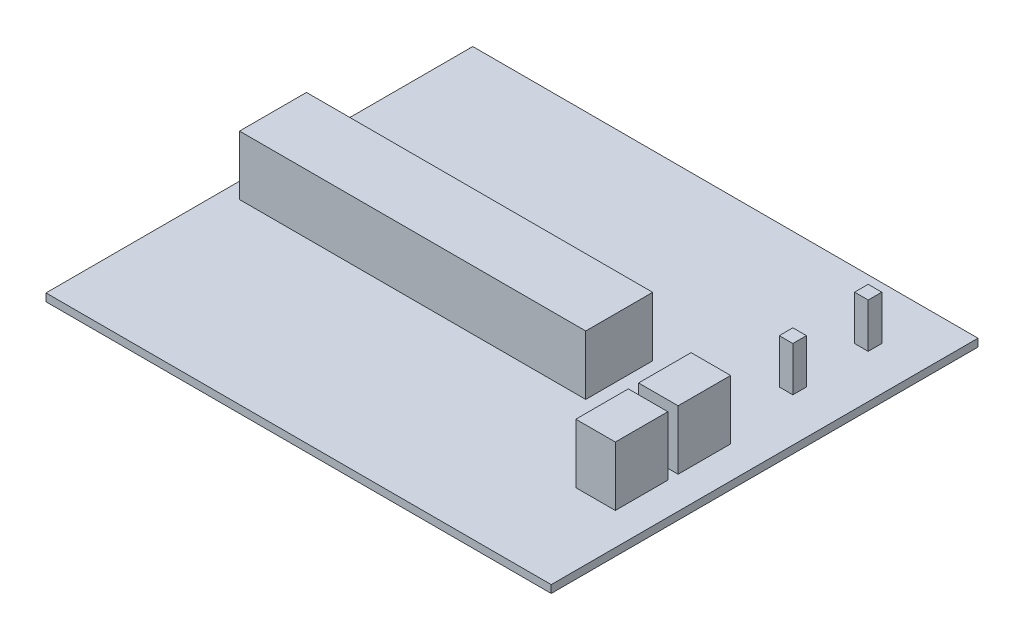
ISO-10303-21;
HEADER;
FILE_DESCRIPTION(('STEP AP214'),'2;1');
FILE_NAME('part.step','',(''),(''),'','','');
FILE_SCHEMA(('AUTOMOTIVE_DESIGN { 1 0 10303 214 1 1 1 1 }'));
ENDSEC;
DATA;
#1=APPLICATION_CONTEXT('core data for automotive mechanical design processes');
#2=APPLICATION_PROTOCOL_DEFINITION('international standard','automotive_design',2000,#1);
#3=PRODUCT_CONTEXT('',#1,'mechanical');
#4=PRODUCT('Part','Part','',(#3));
#5=PRODUCT_RELATED_PRODUCT_CATEGORY('part','',(#4));
#6=PRODUCT_DEFINITION_FORMATION('','',#4);
#7=PRODUCT_DEFINITION_CONTEXT('part definition',#1,'design');
#8=PRODUCT_DEFINITION('design','',#6,#7);
#9=PRODUCT_DEFINITION_SHAPE('','',#8);
#10=(LENGTH_UNIT() NAMED_UNIT(*) SI_UNIT(.MILLI.,.METRE.));
#11=(NAMED_UNIT(*) PLANE_ANGLE_UNIT() SI_UNIT($,.RADIAN.));
#12=(NAMED_UNIT(*) SI_UNIT($,.STERADIAN.) SOLID_ANGLE_UNIT());
#13=UNCERTAINTY_MEASURE_WITH_UNIT(LENGTH_MEASURE(1.E-05),#10,'distance_accuracy_value','');
#14=(GEOMETRIC_REPRESENTATION_CONTEXT(3) GLOBAL_UNCERTAINTY_ASSIGNED_CONTEXT((#13)) GLOBAL_UNIT_ASSIGNED_CONTEXT((#10,
#11,#12)) REPRESENTATION_CONTEXT('',''));
#15=CARTESIAN_POINT('',(0.,0.,0.));
#16=DIRECTION('',(0.,0.,1.));
#17=DIRECTION('',(1.,0.,0.));
#18=AXIS2_PLACEMENT_3D('',#15,#16,#17);
#19=CARTESIAN_POINT('',(0.,1.56,0.));
#20=DIRECTION('',(0.,1.,0.));
#21=DIRECTION('',(0.,0.,1.));
#22=AXIS2_PLACEMENT_3D('',#19,#20,#21);
#23=PLANE('',#22);
#24=DIRECTION('',(-1.,0.,0.));
#25=VECTOR('',#24,1.);
#26=CARTESIAN_POINT('',(93.310019631579,1.56,-60.0792884210526));
#27=LINE('',#26,#25);
#28=CARTESIAN_POINT('',(93.310019631579,1.56,-60.0792884210526));
#29=VERTEX_POINT('',#28);
#30=CARTESIAN_POINT('',(90.558352631579,1.56,-60.0792884210526));
#31=VERTEX_POINT('',#30);
#32=EDGE_CURVE('E224',#29,#31,#27,.T.);
#33=ORIENTED_EDGE('',*,*,#32,.F.);
#34=DIRECTION('',(0.,0.,-1.));
#35=VECTOR('',#34,1.);
#36=CARTESIAN_POINT('',(93.310019631579,1.56,-57.3276214210526));
#37=LINE('',#36,#35);
#38=CARTESIAN_POINT('',(93.310019631579,1.56,-57.3276214210526));
#39=VERTEX_POINT('',#38);
#40=EDGE_CURVE('E221',#39,#29,#37,.T.);
#41=ORIENTED_EDGE('',*,*,#40,.F.);
#42=DIRECTION('',(1.,0.,0.));
#43=VECTOR('',#42,1.);
#44=CARTESIAN_POINT('',(90.558352631579,1.56,-57.3276214210526));
#45=LINE('',#44,#43);
#46=CARTESIAN_POINT('',(90.558352631579,1.56,-57.3276214210526));
#47=VERTEX_POINT('',#46);
#48=EDGE_CURVE('E233',#47,#39,#45,.T.);
#49=ORIENTED_EDGE('',*,*,#48,.F.);
#50=DIRECTION('',(0.,0.,1.));
#51=VECTOR('',#50,1.);
#52=CARTESIAN_POINT('',(90.558352631579,1.56,-60.0792884210526));
#53=LINE('',#52,#51);
#54=EDGE_CURVE('E241',#31,#47,#53,.T.);
#55=ORIENTED_EDGE('',*,*,#54,.F.);
#56=EDGE_LOOP('',(#33,#41,#49,#55));
#57=FACE_BOUND('',#56,.T.);
#58=DIRECTION('',(1.,0.,0.));
#59=VECTOR('',#58,1.);
#60=CARTESIAN_POINT('',(95.615352631579,1.56,-31.8006214210526));
#61=LINE('',#60,#59);
#62=CARTESIAN_POINT('',(87.615352631579,1.56,-31.8006214210526));
#63=VERTEX_POINT('',#62);
#64=CARTESIAN_POINT('',(95.615352631579,1.56,-31.8006214210526));
#65=VERTEX_POINT('',#64);
#66=EDGE_CURVE('E295',#63,#65,#61,.T.);
#67=ORIENTED_EDGE('',*,*,#66,.F.);
#68=DIRECTION('',(0.,0.,1.));
#69=VECTOR('',#68,1.);
#70=CARTESIAN_POINT('',(87.615352631579,1.56,-31.8006214210526));
#71=LINE('',#70,#69);
#72=CARTESIAN_POINT('',(87.615352631579,1.56,-42.4262884210526));
#73=VERTEX_POINT('',#72);
#74=EDGE_CURVE('E281',#73,#63,#71,.T.);
#75=ORIENTED_EDGE('',*,*,#74,.F.);
#76=DIRECTION('',(-1.,0.,0.));
#77=VECTOR('',#76,1.);
#78=CARTESIAN_POINT('',(87.615352631579,1.56,-42.4262884210526));
#79=LINE('',#78,#77);
#80=CARTESIAN_POINT('',(95.615352631579,1.56,-42.4262884210526));
#81=VERTEX_POINT('',#80);
#82=EDGE_CURVE('E286',#81,#73,#79,.T.);
#83=ORIENTED_EDGE('',*,*,#82,.F.);
#84=DIRECTION('',(0.,0.,-1.));
#85=VECTOR('',#84,1.);
#86=CARTESIAN_POINT('',(95.615352631579,1.56,-42.4262884210526));
#87=LINE('',#86,#85);
#88=EDGE_CURVE('E297',#65,#81,#87,.T.);
#89=ORIENTED_EDGE('',*,*,#88,.F.);
#90=EDGE_LOOP('',(#67,#75,#83,#89));
#91=FACE_BOUND('',#90,.T.);
#92=DIRECTION('',(-1.,0.,0.));
#93=VECTOR('',#92,1.);
#94=CARTESIAN_POINT('',(102.115352631579,1.56,-85.9872884210526));
#95=LINE('',#94,#93);
#96=CARTESIAN_POINT('',(102.115352631579,1.56,-85.9872884210526));
#97=VERTEX_POINT('',#96);
#98=CARTESIAN_POINT('',(-0.119647368421035,1.56,-85.9872884210526));
#99=VERTEX_POINT('',#98);
#100=EDGE_CURVE('E340',#97,#99,#95,.T.);
#101=ORIENTED_EDGE('',*,*,#100,.T.);
#102=DIRECTION('',(0.,0.,1.));
#103=VECTOR('',#102,1.);
#104=CARTESIAN_POINT('',(-0.119647368421035,1.56,-85.9872884210526));
#105=LINE('',#104,#103);
#106=CARTESIAN_POINT('',(-0.119647368421035,1.56,0.372711578947374));
#107=VERTEX_POINT('',#106);
#108=EDGE_CURVE('E343',#99,#107,#105,.T.);
#109=ORIENTED_EDGE('',*,*,#108,.T.);
#110=DIRECTION('',(1.,0.,0.));
#111=VECTOR('',#110,1.);
#112=CARTESIAN_POINT('',(-0.119647368421035,1.56,0.372711578947374));
#113=LINE('',#112,#111);
#114=CARTESIAN_POINT('',(102.115352631579,1.56,0.372711578947374));
#115=VERTEX_POINT('',#114);
#116=EDGE_CURVE('E346',#107,#115,#113,.T.);
#117=ORIENTED_EDGE('',*,*,#116,.T.);
#118=DIRECTION('',(0.,0.,-1.));
#119=VECTOR('',#118,1.);
#120=CARTESIAN_POINT('',(102.115352631579,1.56,0.372711578947374));
#121=LINE('',#120,#119);
#122=EDGE_CURVE('E348',#115,#97,#121,.T.);
#123=ORIENTED_EDGE('',*,*,#122,.T.);
#124=EDGE_LOOP('',(#101,#109,#117,#123));
#125=FACE_BOUND('',#124,.T.);
#126=DIRECTION('',(1.,0.,0.));
#127=VECTOR('',#126,1.);
#128=CARTESIAN_POINT('',(3.09768663157897,1.56,-35.5682884210526));
#129=LINE('',#128,#127);
#130=CARTESIAN_POINT('',(3.09768663157897,1.56,-35.5682884210526));
#131=VERTEX_POINT('',#130);
#132=CARTESIAN_POINT('',(73.159352631579,1.56,-35.5682884210526));
#133=VERTEX_POINT('',#132);
#134=EDGE_CURVE('E324',#131,#133,#129,.T.);
#135=ORIENTED_EDGE('',*,*,#134,.F.);
#136=DIRECTION('',(0.,0.,1.));
#137=VECTOR('',#136,1.);
#138=CARTESIAN_POINT('',(3.09768663157897,1.56,-49.1149544210526));
#139=LINE('',#138,#137);
#140=CARTESIAN_POINT('',(3.09768663157897,1.56,-49.1149544210526));
#141=VERTEX_POINT('',#140);
#142=EDGE_CURVE('E310',#141,#131,#139,.T.);
#143=ORIENTED_EDGE('',*,*,#142,.F.);
#144=DIRECTION('',(-1.,0.,0.));
#145=VECTOR('',#144,1.);
#146=CARTESIAN_POINT('',(73.159352631579,1.56,-49.1149544210526));
#147=LINE('',#146,#145);
#148=CARTESIAN_POINT('',(73.159352631579,1.56,-49.1149544210526));
#149=VERTEX_POINT('',#148);
#150=EDGE_CURVE('E315',#149,#141,#147,.T.);
#151=ORIENTED_EDGE('',*,*,#150,.F.);
#152=DIRECTION('',(0.,0.,-1.));
#153=VECTOR('',#152,1.);
#154=CARTESIAN_POINT('',(73.159352631579,1.56,-35.5682884210526));
#155=LINE('',#154,#153);
#156=EDGE_CURVE('E326',#133,#149,#155,.T.);
#157=ORIENTED_EDGE('',*,*,#156,.F.);
#158=EDGE_LOOP('',(#135,#143,#151,#157));
#159=FACE_BOUND('',#158,.T.);
#160=DIRECTION('',(0.,0.,1.));
#161=VECTOR('',#160,1.);
#162=CARTESIAN_POINT('',(87.615352631579,1.56,-29.7262884210526));
#163=LINE('',#162,#161);
#164=CARTESIAN_POINT('',(87.615352631579,1.56,-29.7262884210526));
#165=VERTEX_POINT('',#164);
#166=CARTESIAN_POINT('',(87.615352631579,1.56,-19.1006214210526));
#167=VERTEX_POINT('',#166);
#168=EDGE_CURVE('E266',#165,#167,#163,.T.);
#169=ORIENTED_EDGE('',*,*,#168,.F.);
#170=DIRECTION('',(-1.,0.,0.));
#171=VECTOR('',#170,1.);
#172=CARTESIAN_POINT('',(95.615352631579,1.56,-29.7262884210526));
#173=LINE('',#172,#171);
#174=CARTESIAN_POINT('',(95.615352631579,1.56,-29.7262884210526));
#175=VERTEX_POINT('',#174);
#176=EDGE_CURVE('E252',#175,#165,#173,.T.);
#177=ORIENTED_EDGE('',*,*,#176,.F.);
#178=DIRECTION('',(0.,0.,-1.));
#179=VECTOR('',#178,1.);
#180=CARTESIAN_POINT('',(95.615352631579,1.56,-19.1006214210526));
#181=LINE('',#180,#179);
#182=CARTESIAN_POINT('',(95.615352631579,1.56,-19.1006214210526));
#183=VERTEX_POINT('',#182);
#184=EDGE_CURVE('E257',#183,#175,#181,.T.);
#185=ORIENTED_EDGE('',*,*,#184,.F.);
#186=DIRECTION('',(1.,0.,0.));
#187=VECTOR('',#186,1.);
#188=CARTESIAN_POINT('',(87.615352631579,1.56,-19.1006214210526));
#189=LINE('',#188,#187);
#190=EDGE_CURVE('E268',#167,#183,#189,.T.);
#191=ORIENTED_EDGE('',*,*,#190,.F.);
#192=EDGE_LOOP('',(#169,#177,#185,#191));
#193=FACE_BOUND('',#192,.T.);
#194=DIRECTION('',(1.,0.,0.));
#195=VECTOR('',#194,1.);
#196=CARTESIAN_POINT('',(90.558352631579,1.56,-72.5676214210526));
#197=LINE('',#196,#195);
#198=CARTESIAN_POINT('',(90.558352631579,1.56,-72.5676214210526));
#199=VERTEX_POINT('',#198);
#200=CARTESIAN_POINT('',(93.310019631579,1.56,-72.5676214210526));
#201=VERTEX_POINT('',#200);
#202=EDGE_CURVE('E684',#199,#201,#197,.T.);
#203=ORIENTED_EDGE('',*,*,#202,.F.);
#204=DIRECTION('',(0.,0.,1.));
#205=VECTOR('',#204,1.);
#206=CARTESIAN_POINT('',(90.558352631579,1.56,-75.3192884210526));
#207=LINE('',#206,#205);
#208=CARTESIAN_POINT('',(90.558352631579,1.56,-75.3192884210526));
#209=VERTEX_POINT('',#208);
#210=EDGE_CURVE('E219',#209,#199,#207,.T.);
#211=ORIENTED_EDGE('',*,*,#210,.F.);
#212=DIRECTION('',(-1.,0.,0.));
#213=VECTOR('',#212,1.);
#214=CARTESIAN_POINT('',(93.310019631579,1.56,-75.3192884210526));
#215=LINE('',#214,#213);
#216=CARTESIAN_POINT('',(93.310019631579,1.56,-75.3192884210526));
#217=VERTEX_POINT('',#216);
#218=EDGE_CURVE('E215',#217,#209,#215,.T.);
#219=ORIENTED_EDGE('',*,*,#218,.F.);
#220=DIRECTION('',(0.,0.,-1.));
#221=VECTOR('',#220,1.);
#222=CARTESIAN_POINT('',(93.310019631579,1.56,-72.5676214210526));
#223=LINE('',#222,#221);
#224=EDGE_CURVE('E681',#201,#217,#223,.T.);
#225=ORIENTED_EDGE('',*,*,#224,.F.);
#226=EDGE_LOOP('',(#203,#211,#219,#225));
#227=FACE_BOUND('',#226,.T.);
#228=ADVANCED_FACE('F34',(#57,#91,#125,#159,#193,#227),#23,.T.);
#229=CARTESIAN_POINT('',(102.115352631579,1.56,-85.9872884210526));
#230=DIRECTION('',(0.,0.,1.));
#231=DIRECTION('',(1.,0.,0.));
#232=AXIS2_PLACEMENT_3D('',#229,#230,#231);
#233=PLANE('',#232);
#234=DIRECTION('',(-1.,0.,0.));
#235=VECTOR('',#234,1.);
#236=CARTESIAN_POINT('',(102.115352631579,0.,-85.9872884210526));
#237=LINE('',#236,#235);
#238=CARTESIAN_POINT('',(102.115352631579,0.,-85.9872884210526));
#239=VERTEX_POINT('',#238);
#240=CARTESIAN_POINT('',(-0.119647368421035,0.,-85.9872884210526));
#241=VERTEX_POINT('',#240);
#242=EDGE_CURVE('E339',#239,#241,#237,.T.);
#243=ORIENTED_EDGE('',*,*,#242,.T.);
#244=DIRECTION('',(0.,-1.,0.));
#245=VECTOR('',#244,1.);
#246=CARTESIAN_POINT('',(-0.119647368421035,1.56,-85.9872884210526));
#247=LINE('',#246,#245);
#248=EDGE_CURVE('E11',#99,#241,#247,.T.);
#249=ORIENTED_EDGE('',*,*,#248,.F.);
#250=ORIENTED_EDGE('',*,*,#100,.F.);
#251=DIRECTION('',(0.,-1.,0.));
#252=VECTOR('',#251,1.);
#253=CARTESIAN_POINT('',(102.115352631579,1.56,-85.9872884210526));
#254=LINE('',#253,#252);
#255=EDGE_CURVE('E350',#97,#239,#254,.T.);
#256=ORIENTED_EDGE('',*,*,#255,.T.);
#257=EDGE_LOOP('',(#243,#249,#250,#256));
#258=FACE_BOUND('',#257,.T.);
#259=ADVANCED_FACE('F36',(#258),#233,.F.);
#260=CARTESIAN_POINT('',(-0.119647368421035,1.56,-85.9872884210526));
#261=DIRECTION('',(1.,0.,0.));
#262=DIRECTION('',(0.,0.,-1.));
#263=AXIS2_PLACEMENT_3D('',#260,#261,#262);
#264=PLANE('',#263);
#265=DIRECTION('',(0.,0.,1.));
#266=VECTOR('',#265,1.);
#267=CARTESIAN_POINT('',(-0.119647368421035,0.,-85.9872884210526));
#268=LINE('',#267,#266);
#269=CARTESIAN_POINT('',(-0.119647368421035,0.,0.372711578947374));
#270=VERTEX_POINT('',#269);
#271=EDGE_CURVE('E353',#241,#270,#268,.T.);
#272=ORIENTED_EDGE('',*,*,#271,.T.);
#273=DIRECTION('',(0.,-1.,0.));
#274=VECTOR('',#273,1.);
#275=CARTESIAN_POINT('',(-0.119647368421035,1.56,0.372711578947374));
#276=LINE('',#275,#274);
#277=EDGE_CURVE('E42',#107,#270,#276,.T.);
#278=ORIENTED_EDGE('',*,*,#277,.F.);
#279=ORIENTED_EDGE('',*,*,#108,.F.);
#280=ORIENTED_EDGE('',*,*,#248,.T.);
#281=EDGE_LOOP('',(#272,#278,#279,#280));
#282=FACE_BOUND('',#281,.T.);
#283=ADVANCED_FACE('F383',(#282),#264,.F.);
#284=CARTESIAN_POINT('',(-0.119647368421035,1.56,0.372711578947374));
#285=DIRECTION('',(0.,0.,-1.));
#286=DIRECTION('',(-1.,0.,0.));
#287=AXIS2_PLACEMENT_3D('',#284,#285,#286);
#288=PLANE('',#287);
#289=DIRECTION('',(1.,0.,0.));
#290=VECTOR('',#289,1.);
#291=CARTESIAN_POINT('',(-0.119647368421035,0.,0.372711578947374));
#292=LINE('',#291,#290);
#293=CARTESIAN_POINT('',(102.115352631579,0.,0.372711578947374));
#294=VERTEX_POINT('',#293);
#295=EDGE_CURVE('E355',#270,#294,#292,.T.);
#296=ORIENTED_EDGE('',*,*,#295,.T.);
#297=DIRECTION('',(0.,-1.,0.));
#298=VECTOR('',#297,1.);
#299=CARTESIAN_POINT('',(102.115352631579,1.56,0.372711578947374));
#300=LINE('',#299,#298);
#301=EDGE_CURVE('E360',#115,#294,#300,.T.);
#302=ORIENTED_EDGE('',*,*,#301,.F.);
#303=ORIENTED_EDGE('',*,*,#116,.F.);
#304=ORIENTED_EDGE('',*,*,#277,.T.);
#305=EDGE_LOOP('',(#296,#302,#303,#304));
#306=FACE_BOUND('',#305,.T.);
#307=ADVANCED_FACE('F367',(#306),#288,.F.);
#308=CARTESIAN_POINT('',(102.115352631579,1.56,0.372711578947374));
#309=DIRECTION('',(-1.,0.,0.));
#310=DIRECTION('',(0.,0.,1.));
#311=AXIS2_PLACEMENT_3D('',#308,#309,#310);
#312=PLANE('',#311);
#313=DIRECTION('',(0.,0.,-1.));
#314=VECTOR('',#313,1.);
#315=CARTESIAN_POINT('',(102.115352631579,0.,0.372711578947374));
#316=LINE('',#315,#314);
#317=EDGE_CURVE('E344',#294,#239,#316,.T.);
#318=ORIENTED_EDGE('',*,*,#317,.T.);
#319=ORIENTED_EDGE('',*,*,#255,.F.);
#320=ORIENTED_EDGE('',*,*,#122,.F.);
#321=ORIENTED_EDGE('',*,*,#301,.T.);
#322=EDGE_LOOP('',(#318,#319,#320,#321));
#323=FACE_BOUND('',#322,.T.);
#324=ADVANCED_FACE('F376',(#323),#312,.F.);
#325=CARTESIAN_POINT('',(0.,0.,0.));
#326=DIRECTION('',(0.,1.,0.));
#327=DIRECTION('',(0.,0.,1.));
#328=AXIS2_PLACEMENT_3D('',#325,#326,#327);
#329=PLANE('',#328);
#330=ORIENTED_EDGE('',*,*,#242,.F.);
#331=ORIENTED_EDGE('',*,*,#317,.F.);
#332=ORIENTED_EDGE('',*,*,#295,.F.);
#333=ORIENTED_EDGE('',*,*,#271,.F.);
#334=EDGE_LOOP('',(#330,#331,#332,#333));
#335=FACE_BOUND('',#334,.T.);
#336=ADVANCED_FACE('F373',(#335),#329,.F.);
#337=CARTESIAN_POINT('',(3.09768663157897,13.56,-49.1149544210526));
#338=DIRECTION('',(1.,0.,0.));
#339=DIRECTION('',(0.,0.,-1.));
#340=AXIS2_PLACEMENT_3D('',#337,#338,#339);
#341=PLANE('',#340);
#342=ORIENTED_EDGE('',*,*,#142,.T.);
#343=DIRECTION('',(0.,-1.,0.));
#344=VECTOR('',#343,1.);
#345=CARTESIAN_POINT('',(3.09768663157897,13.56,-35.5682884210526));
#346=LINE('',#345,#344);
#347=CARTESIAN_POINT('',(3.09768663157897,13.56,-35.5682884210526));
#348=VERTEX_POINT('',#347);
#349=EDGE_CURVE('E337',#348,#131,#346,.T.);
#350=ORIENTED_EDGE('',*,*,#349,.F.);
#351=DIRECTION('',(0.,0.,1.));
#352=VECTOR('',#351,1.);
#353=CARTESIAN_POINT('',(3.09768663157897,13.56,-49.1149544210526));
#354=LINE('',#353,#352);
#355=CARTESIAN_POINT('',(3.09768663157897,13.56,-49.1149544210526));
#356=VERTEX_POINT('',#355);
#357=EDGE_CURVE('E311',#356,#348,#354,.T.);
#358=ORIENTED_EDGE('',*,*,#357,.F.);
#359=DIRECTION('',(0.,-1.,0.));
#360=VECTOR('',#359,1.);
#361=CARTESIAN_POINT('',(3.09768663157897,13.56,-49.1149544210526));
#362=LINE('',#361,#360);
#363=EDGE_CURVE('E321',#356,#141,#362,.T.);
#364=ORIENTED_EDGE('',*,*,#363,.T.);
#365=EDGE_LOOP('',(#342,#350,#358,#364));
#366=FACE_BOUND('',#365,.T.);
#367=ADVANCED_FACE('F399',(#366),#341,.F.);
#368=CARTESIAN_POINT('',(3.09768663157897,13.56,-35.5682884210526));
#369=DIRECTION('',(0.,0.,-1.));
#370=DIRECTION('',(-1.,0.,0.));
#371=AXIS2_PLACEMENT_3D('',#368,#369,#370);
#372=PLANE('',#371);
#373=ORIENTED_EDGE('',*,*,#134,.T.);
#374=DIRECTION('',(0.,-1.,0.));
#375=VECTOR('',#374,1.);
#376=CARTESIAN_POINT('',(73.159352631579,13.56,-35.5682884210526));
#377=LINE('',#376,#375);
#378=CARTESIAN_POINT('',(73.159352631579,13.56,-35.5682884210526));
#379=VERTEX_POINT('',#378);
#380=EDGE_CURVE('E334',#379,#133,#377,.T.);
#381=ORIENTED_EDGE('',*,*,#380,.F.);
#382=DIRECTION('',(1.,0.,0.));
#383=VECTOR('',#382,1.);
#384=CARTESIAN_POINT('',(3.09768663157897,13.56,-35.5682884210526));
#385=LINE('',#384,#383);
#386=EDGE_CURVE('E314',#348,#379,#385,.T.);
#387=ORIENTED_EDGE('',*,*,#386,.F.);
#388=ORIENTED_EDGE('',*,*,#349,.T.);
#389=EDGE_LOOP('',(#373,#381,#387,#388));
#390=FACE_BOUND('',#389,.T.);
#391=ADVANCED_FACE('F418',(#390),#372,.F.);
#392=CARTESIAN_POINT('',(73.159352631579,13.56,-35.5682884210526));
#393=DIRECTION('',(-1.,0.,0.));
#394=DIRECTION('',(0.,0.,1.));
#395=AXIS2_PLACEMENT_3D('',#392,#393,#394);
#396=PLANE('',#395);
#397=ORIENTED_EDGE('',*,*,#156,.T.);
#398=DIRECTION('',(0.,-1.,0.));
#399=VECTOR('',#398,1.);
#400=CARTESIAN_POINT('',(73.159352631579,13.56,-49.1149544210526));
#401=LINE('',#400,#399);
#402=CARTESIAN_POINT('',(73.159352631579,13.56,-49.1149544210526));
#403=VERTEX_POINT('',#402);
#404=EDGE_CURVE('E332',#403,#149,#401,.T.);
#405=ORIENTED_EDGE('',*,*,#404,.F.);
#406=DIRECTION('',(0.,0.,-1.));
#407=VECTOR('',#406,1.);
#408=CARTESIAN_POINT('',(73.159352631579,13.56,-35.5682884210526));
#409=LINE('',#408,#407);
#410=EDGE_CURVE('E317',#379,#403,#409,.T.);
#411=ORIENTED_EDGE('',*,*,#410,.F.);
#412=ORIENTED_EDGE('',*,*,#380,.T.);
#413=EDGE_LOOP('',(#397,#405,#411,#412));
#414=FACE_BOUND('',#413,.T.);
#415=ADVANCED_FACE('F425',(#414),#396,.F.);
#416=CARTESIAN_POINT('',(73.159352631579,13.56,-49.1149544210526));
#417=DIRECTION('',(0.,0.,1.));
#418=DIRECTION('',(1.,0.,0.));
#419=AXIS2_PLACEMENT_3D('',#416,#417,#418);
#420=PLANE('',#419);
#421=ORIENTED_EDGE('',*,*,#150,.T.);
#422=ORIENTED_EDGE('',*,*,#363,.F.);
#423=DIRECTION('',(-1.,0.,0.));
#424=VECTOR('',#423,1.);
#425=CARTESIAN_POINT('',(73.159352631579,13.56,-49.1149544210526));
#426=LINE('',#425,#424);
#427=EDGE_CURVE('E319',#403,#356,#426,.T.);
#428=ORIENTED_EDGE('',*,*,#427,.F.);
#429=ORIENTED_EDGE('',*,*,#404,.T.);
#430=EDGE_LOOP('',(#421,#422,#428,#429));
#431=FACE_BOUND('',#430,.T.);
#432=ADVANCED_FACE('F432',(#431),#420,.F.);
#433=CARTESIAN_POINT('',(0.,13.56,0.));
#434=DIRECTION('',(0.,1.,0.));
#435=DIRECTION('',(0.,0.,1.));
#436=AXIS2_PLACEMENT_3D('',#433,#434,#435);
#437=PLANE('',#436);
#438=ORIENTED_EDGE('',*,*,#357,.T.);
#439=ORIENTED_EDGE('',*,*,#386,.T.);
#440=ORIENTED_EDGE('',*,*,#410,.T.);
#441=ORIENTED_EDGE('',*,*,#427,.T.);
#442=EDGE_LOOP('',(#438,#439,#440,#441));
#443=FACE_BOUND('',#442,.T.);
#444=ADVANCED_FACE('F440',(#443),#437,.T.);
#445=CARTESIAN_POINT('',(87.615352631579,13.56,-31.8006214210526));
#446=DIRECTION('',(1.,0.,0.));
#447=DIRECTION('',(0.,0.,-1.));
#448=AXIS2_PLACEMENT_3D('',#445,#446,#447);
#449=PLANE('',#448);
#450=ORIENTED_EDGE('',*,*,#74,.T.);
#451=DIRECTION('',(0.,-1.,0.));
#452=VECTOR('',#451,1.);
#453=CARTESIAN_POINT('',(87.615352631579,13.56,-31.8006214210526));
#454=LINE('',#453,#452);
#455=CARTESIAN_POINT('',(87.615352631579,13.56,-31.8006214210526));
#456=VERTEX_POINT('',#455);
#457=EDGE_CURVE('E308',#456,#63,#454,.T.);
#458=ORIENTED_EDGE('',*,*,#457,.F.);
#459=DIRECTION('',(0.,0.,1.));
#460=VECTOR('',#459,1.);
#461=CARTESIAN_POINT('',(87.615352631579,13.56,-31.8006214210526));
#462=LINE('',#461,#460);
#463=CARTESIAN_POINT('',(87.615352631579,13.56,-42.4262884210526));
#464=VERTEX_POINT('',#463);
#465=EDGE_CURVE('E282',#464,#456,#462,.T.);
#466=ORIENTED_EDGE('',*,*,#465,.F.);
#467=DIRECTION('',(0.,-1.,0.));
#468=VECTOR('',#467,1.);
#469=CARTESIAN_POINT('',(87.615352631579,13.56,-42.4262884210526));
#470=LINE('',#469,#468);
#471=EDGE_CURVE('E292',#464,#73,#470,.T.);
#472=ORIENTED_EDGE('',*,*,#471,.T.);
#473=EDGE_LOOP('',(#450,#458,#466,#472));
#474=FACE_BOUND('',#473,.T.);
#475=ADVANCED_FACE('F449',(#474),#449,.F.);
#476=CARTESIAN_POINT('',(95.615352631579,13.56,-31.8006214210526));
#477=DIRECTION('',(0.,0.,-1.));
#478=DIRECTION('',(-1.,0.,0.));
#479=AXIS2_PLACEMENT_3D('',#476,#477,#478);
#480=PLANE('',#479);
#481=ORIENTED_EDGE('',*,*,#66,.T.);
#482=DIRECTION('',(0.,-1.,0.));
#483=VECTOR('',#482,1.);
#484=CARTESIAN_POINT('',(95.615352631579,13.56,-31.8006214210526));
#485=LINE('',#484,#483);
#486=CARTESIAN_POINT('',(95.615352631579,13.56,-31.8006214210526));
#487=VERTEX_POINT('',#486);
#488=EDGE_CURVE('E305',#487,#65,#485,.T.);
#489=ORIENTED_EDGE('',*,*,#488,.F.);
#490=DIRECTION('',(1.,0.,0.));
#491=VECTOR('',#490,1.);
#492=CARTESIAN_POINT('',(95.615352631579,13.56,-31.8006214210526));
#493=LINE('',#492,#491);
#494=EDGE_CURVE('E285',#456,#487,#493,.T.);
#495=ORIENTED_EDGE('',*,*,#494,.F.);
#496=ORIENTED_EDGE('',*,*,#457,.T.);
#497=EDGE_LOOP('',(#481,#489,#495,#496));
#498=FACE_BOUND('',#497,.T.);
#499=ADVANCED_FACE('F456',(#498),#480,.F.);
#500=CARTESIAN_POINT('',(95.615352631579,13.56,-42.4262884210526));
#501=DIRECTION('',(-1.,0.,0.));
#502=DIRECTION('',(0.,0.,1.));
#503=AXIS2_PLACEMENT_3D('',#500,#501,#502);
#504=PLANE('',#503);
#505=ORIENTED_EDGE('',*,*,#88,.T.);
#506=DIRECTION('',(0.,-1.,0.));
#507=VECTOR('',#506,1.);
#508=CARTESIAN_POINT('',(95.615352631579,13.56,-42.4262884210526));
#509=LINE('',#508,#507);
#510=CARTESIAN_POINT('',(95.615352631579,13.56,-42.4262884210526));
#511=VERTEX_POINT('',#510);
#512=EDGE_CURVE('E303',#511,#81,#509,.T.);
#513=ORIENTED_EDGE('',*,*,#512,.F.);
#514=DIRECTION('',(0.,0.,-1.));
#515=VECTOR('',#514,1.);
#516=CARTESIAN_POINT('',(95.615352631579,13.56,-42.4262884210526));
#517=LINE('',#516,#515);
#518=EDGE_CURVE('E288',#487,#511,#517,.T.);
#519=ORIENTED_EDGE('',*,*,#518,.F.);
#520=ORIENTED_EDGE('',*,*,#488,.T.);
#521=EDGE_LOOP('',(#505,#513,#519,#520));
#522=FACE_BOUND('',#521,.T.);
#523=ADVANCED_FACE('F464',(#522),#504,.F.);
#524=CARTESIAN_POINT('',(87.615352631579,13.56,-42.4262884210526));
#525=DIRECTION('',(0.,0.,1.));
#526=DIRECTION('',(1.,0.,0.));
#527=AXIS2_PLACEMENT_3D('',#524,#525,#526);
#528=PLANE('',#527);
#529=ORIENTED_EDGE('',*,*,#82,.T.);
#530=ORIENTED_EDGE('',*,*,#471,.F.);
#531=DIRECTION('',(-1.,0.,0.));
#532=VECTOR('',#531,1.);
#533=CARTESIAN_POINT('',(87.615352631579,13.56,-42.4262884210526));
#534=LINE('',#533,#532);
#535=EDGE_CURVE('E290',#511,#464,#534,.T.);
#536=ORIENTED_EDGE('',*,*,#535,.F.);
#537=ORIENTED_EDGE('',*,*,#512,.T.);
#538=EDGE_LOOP('',(#529,#530,#536,#537));
#539=FACE_BOUND('',#538,.T.);
#540=ADVANCED_FACE('F472',(#539),#528,.F.);
#541=CARTESIAN_POINT('',(0.,13.56,0.));
#542=DIRECTION('',(0.,-1.,0.));
#543=DIRECTION('',(0.,0.,-1.));
#544=AXIS2_PLACEMENT_3D('',#541,#542,#543);
#545=PLANE('',#544);
#546=ORIENTED_EDGE('',*,*,#465,.T.);
#547=ORIENTED_EDGE('',*,*,#494,.T.);
#548=ORIENTED_EDGE('',*,*,#518,.T.);
#549=ORIENTED_EDGE('',*,*,#535,.T.);
#550=EDGE_LOOP('',(#546,#547,#548,#549));
#551=FACE_BOUND('',#550,.T.);
#552=ADVANCED_FACE('F480',(#551),#545,.F.);
#553=CARTESIAN_POINT('',(95.615352631579,13.56,-29.7262884210526));
#554=DIRECTION('',(0.,0.,1.));
#555=DIRECTION('',(1.,0.,0.));
#556=AXIS2_PLACEMENT_3D('',#553,#554,#555);
#557=PLANE('',#556);
#558=ORIENTED_EDGE('',*,*,#176,.T.);
#559=DIRECTION('',(0.,-1.,0.));
#560=VECTOR('',#559,1.);
#561=CARTESIAN_POINT('',(87.615352631579,13.56,-29.7262884210526));
#562=LINE('',#561,#560);
#563=CARTESIAN_POINT('',(87.615352631579,13.56,-29.7262884210526));
#564=VERTEX_POINT('',#563);
#565=EDGE_CURVE('E279',#564,#165,#562,.T.);
#566=ORIENTED_EDGE('',*,*,#565,.F.);
#567=DIRECTION('',(-1.,0.,0.));
#568=VECTOR('',#567,1.);
#569=CARTESIAN_POINT('',(95.615352631579,13.56,-29.7262884210526));
#570=LINE('',#569,#568);
#571=CARTESIAN_POINT('',(95.615352631579,13.56,-29.7262884210526));
#572=VERTEX_POINT('',#571);
#573=EDGE_CURVE('E253',#572,#564,#570,.T.);
#574=ORIENTED_EDGE('',*,*,#573,.F.);
#575=DIRECTION('',(0.,-1.,0.));
#576=VECTOR('',#575,1.);
#577=CARTESIAN_POINT('',(95.615352631579,13.56,-29.7262884210526));
#578=LINE('',#577,#576);
#579=EDGE_CURVE('E263',#572,#175,#578,.T.);
#580=ORIENTED_EDGE('',*,*,#579,.T.);
#581=EDGE_LOOP('',(#558,#566,#574,#580));
#582=FACE_BOUND('',#581,.T.);
#583=ADVANCED_FACE('F488',(#582),#557,.F.);
#584=CARTESIAN_POINT('',(87.615352631579,13.56,-29.7262884210526));
#585=DIRECTION('',(1.,0.,0.));
#586=DIRECTION('',(0.,0.,-1.));
#587=AXIS2_PLACEMENT_3D('',#584,#585,#586);
#588=PLANE('',#587);
#589=ORIENTED_EDGE('',*,*,#168,.T.);
#590=DIRECTION('',(0.,-1.,0.));
#591=VECTOR('',#590,1.);
#592=CARTESIAN_POINT('',(87.615352631579,13.56,-19.1006214210526));
#593=LINE('',#592,#591);
#594=CARTESIAN_POINT('',(87.615352631579,13.56,-19.1006214210526));
#595=VERTEX_POINT('',#594);
#596=EDGE_CURVE('E276',#595,#167,#593,.T.);
#597=ORIENTED_EDGE('',*,*,#596,.F.);
#598=DIRECTION('',(0.,0.,1.));
#599=VECTOR('',#598,1.);
#600=CARTESIAN_POINT('',(87.615352631579,13.56,-29.7262884210526));
#601=LINE('',#600,#599);
#602=EDGE_CURVE('E256',#564,#595,#601,.T.);
#603=ORIENTED_EDGE('',*,*,#602,.F.);
#604=ORIENTED_EDGE('',*,*,#565,.T.);
#605=EDGE_LOOP('',(#589,#597,#603,#604));
#606=FACE_BOUND('',#605,.T.);
#607=ADVANCED_FACE('F496',(#606),#588,.F.);
#608=CARTESIAN_POINT('',(87.615352631579,13.56,-19.1006214210526));
#609=DIRECTION('',(0.,0.,-1.));
#610=DIRECTION('',(-1.,0.,0.));
#611=AXIS2_PLACEMENT_3D('',#608,#609,#610);
#612=PLANE('',#611);
#613=ORIENTED_EDGE('',*,*,#190,.T.);
#614=DIRECTION('',(0.,-1.,0.));
#615=VECTOR('',#614,1.);
#616=CARTESIAN_POINT('',(95.615352631579,13.56,-19.1006214210526));
#617=LINE('',#616,#615);
#618=CARTESIAN_POINT('',(95.615352631579,13.56,-19.1006214210526));
#619=VERTEX_POINT('',#618);
#620=EDGE_CURVE('E274',#619,#183,#617,.T.);
#621=ORIENTED_EDGE('',*,*,#620,.F.);
#622=DIRECTION('',(1.,0.,0.));
#623=VECTOR('',#622,1.);
#624=CARTESIAN_POINT('',(87.615352631579,13.56,-19.1006214210526));
#625=LINE('',#624,#623);
#626=EDGE_CURVE('E259',#595,#619,#625,.T.);
#627=ORIENTED_EDGE('',*,*,#626,.F.);
#628=ORIENTED_EDGE('',*,*,#596,.T.);
#629=EDGE_LOOP('',(#613,#621,#627,#628));
#630=FACE_BOUND('',#629,.T.);
#631=ADVANCED_FACE('F504',(#630),#612,.F.);
#632=CARTESIAN_POINT('',(95.615352631579,13.56,-19.1006214210526));
#633=DIRECTION('',(-1.,0.,0.));
#634=DIRECTION('',(0.,0.,1.));
#635=AXIS2_PLACEMENT_3D('',#632,#633,#634);
#636=PLANE('',#635);
#637=ORIENTED_EDGE('',*,*,#184,.T.);
#638=ORIENTED_EDGE('',*,*,#579,.F.);
#639=DIRECTION('',(0.,0.,-1.));
#640=VECTOR('',#639,1.);
#641=CARTESIAN_POINT('',(95.615352631579,13.56,-19.1006214210526));
#642=LINE('',#641,#640);
#643=EDGE_CURVE('E261',#619,#572,#642,.T.);
#644=ORIENTED_EDGE('',*,*,#643,.F.);
#645=ORIENTED_EDGE('',*,*,#620,.T.);
#646=EDGE_LOOP('',(#637,#638,#644,#645));
#647=FACE_BOUND('',#646,.T.);
#648=ADVANCED_FACE('F512',(#647),#636,.F.);
#649=CARTESIAN_POINT('',(0.,13.56,0.));
#650=DIRECTION('',(0.,1.,0.));
#651=DIRECTION('',(0.,0.,1.));
#652=AXIS2_PLACEMENT_3D('',#649,#650,#651);
#653=PLANE('',#652);
#654=ORIENTED_EDGE('',*,*,#573,.T.);
#655=ORIENTED_EDGE('',*,*,#602,.T.);
#656=ORIENTED_EDGE('',*,*,#626,.T.);
#657=ORIENTED_EDGE('',*,*,#643,.T.);
#658=EDGE_LOOP('',(#654,#655,#656,#657));
#659=FACE_BOUND('',#658,.T.);
#660=ADVANCED_FACE('F520',(#659),#653,.T.);
#661=CARTESIAN_POINT('',(93.310019631579,10.56,-57.3276214210526));
#662=DIRECTION('',(-1.,0.,0.));
#663=DIRECTION('',(0.,0.,1.));
#664=AXIS2_PLACEMENT_3D('',#661,#662,#663);
#665=PLANE('',#664);
#666=ORIENTED_EDGE('',*,*,#40,.T.);
#667=DIRECTION('',(0.,-1.,0.));
#668=VECTOR('',#667,1.);
#669=CARTESIAN_POINT('',(93.310019631579,10.56,-60.0792884210526));
#670=LINE('',#669,#668);
#671=CARTESIAN_POINT('',(93.310019631579,10.56,-60.0792884210526));
#672=VERTEX_POINT('',#671);
#673=EDGE_CURVE('E250',#672,#29,#670,.T.);
#674=ORIENTED_EDGE('',*,*,#673,.F.);
#675=DIRECTION('',(0.,0.,-1.));
#676=VECTOR('',#675,1.);
#677=CARTESIAN_POINT('',(93.310019631579,10.56,-57.3276214210526));
#678=LINE('',#677,#676);
#679=CARTESIAN_POINT('',(93.310019631579,10.56,-57.3276214210526));
#680=VERTEX_POINT('',#679);
#681=EDGE_CURVE('E229',#680,#672,#678,.T.);
#682=ORIENTED_EDGE('',*,*,#681,.F.);
#683=DIRECTION('',(0.,-1.,0.));
#684=VECTOR('',#683,1.);
#685=CARTESIAN_POINT('',(93.310019631579,10.56,-57.3276214210526));
#686=LINE('',#685,#684);
#687=EDGE_CURVE('E238',#680,#39,#686,.T.);
#688=ORIENTED_EDGE('',*,*,#687,.T.);
#689=EDGE_LOOP('',(#666,#674,#682,#688));
#690=FACE_BOUND('',#689,.T.);
#691=ADVANCED_FACE('F528',(#690),#665,.F.);
#692=CARTESIAN_POINT('',(93.310019631579,10.56,-60.0792884210526));
#693=DIRECTION('',(0.,0.,1.));
#694=DIRECTION('',(1.,0.,0.));
#695=AXIS2_PLACEMENT_3D('',#692,#693,#694);
#696=PLANE('',#695);
#697=ORIENTED_EDGE('',*,*,#32,.T.);
#698=DIRECTION('',(0.,-1.,0.));
#699=VECTOR('',#698,1.);
#700=CARTESIAN_POINT('',(90.558352631579,10.56,-60.0792884210526));
#701=LINE('',#700,#699);
#702=CARTESIAN_POINT('',(90.558352631579,10.56,-60.0792884210526));
#703=VERTEX_POINT('',#702);
#704=EDGE_CURVE('E247',#703,#31,#701,.T.);
#705=ORIENTED_EDGE('',*,*,#704,.F.);
#706=DIRECTION('',(-1.,0.,0.));
#707=VECTOR('',#706,1.);
#708=CARTESIAN_POINT('',(93.310019631579,10.56,-60.0792884210526));
#709=LINE('',#708,#707);
#710=EDGE_CURVE('E232',#672,#703,#709,.T.);
#711=ORIENTED_EDGE('',*,*,#710,.F.);
#712=ORIENTED_EDGE('',*,*,#673,.T.);
#713=EDGE_LOOP('',(#697,#705,#711,#712));
#714=FACE_BOUND('',#713,.T.);
#715=ADVANCED_FACE('F536',(#714),#696,.F.);
#716=CARTESIAN_POINT('',(90.558352631579,10.56,-60.0792884210526));
#717=DIRECTION('',(1.,0.,0.));
#718=DIRECTION('',(0.,0.,-1.));
#719=AXIS2_PLACEMENT_3D('',#716,#717,#718);
#720=PLANE('',#719);
#721=ORIENTED_EDGE('',*,*,#54,.T.);
#722=DIRECTION('',(0.,-1.,0.));
#723=VECTOR('',#722,1.);
#724=CARTESIAN_POINT('',(90.558352631579,10.56,-57.3276214210526));
#725=LINE('',#724,#723);
#726=CARTESIAN_POINT('',(90.558352631579,10.56,-57.3276214210526));
#727=VERTEX_POINT('',#726);
#728=EDGE_CURVE('E57',#727,#47,#725,.T.);
#729=ORIENTED_EDGE('',*,*,#728,.F.);
#730=DIRECTION('',(0.,0.,1.));
#731=VECTOR('',#730,1.);
#732=CARTESIAN_POINT('',(90.558352631579,10.56,-60.0792884210526));
#733=LINE('',#732,#731);
#734=EDGE_CURVE('E235',#703,#727,#733,.T.);
#735=ORIENTED_EDGE('',*,*,#734,.F.);
#736=ORIENTED_EDGE('',*,*,#704,.T.);
#737=EDGE_LOOP('',(#721,#729,#735,#736));
#738=FACE_BOUND('',#737,.T.);
#739=ADVANCED_FACE('F544',(#738),#720,.F.);
#740=CARTESIAN_POINT('',(90.558352631579,10.56,-57.3276214210526));
#741=DIRECTION('',(0.,0.,-1.));
#742=DIRECTION('',(-1.,0.,0.));
#743=AXIS2_PLACEMENT_3D('',#740,#741,#742);
#744=PLANE('',#743);
#745=ORIENTED_EDGE('',*,*,#48,.T.);
#746=ORIENTED_EDGE('',*,*,#687,.F.);
#747=DIRECTION('',(1.,0.,0.));
#748=VECTOR('',#747,1.);
#749=CARTESIAN_POINT('',(90.558352631579,10.56,-57.3276214210526));
#750=LINE('',#749,#748);
#751=EDGE_CURVE('E237',#727,#680,#750,.T.);
#752=ORIENTED_EDGE('',*,*,#751,.F.);
#753=ORIENTED_EDGE('',*,*,#728,.T.);
#754=EDGE_LOOP('',(#745,#746,#752,#753));
#755=FACE_BOUND('',#754,.T.);
#756=ADVANCED_FACE('F552',(#755),#744,.F.);
#757=CARTESIAN_POINT('',(0.,10.56,0.));
#758=DIRECTION('',(0.,1.,0.));
#759=DIRECTION('',(0.,0.,1.));
#760=AXIS2_PLACEMENT_3D('',#757,#758,#759);
#761=PLANE('',#760);
#762=ORIENTED_EDGE('',*,*,#681,.T.);
#763=ORIENTED_EDGE('',*,*,#710,.T.);
#764=ORIENTED_EDGE('',*,*,#734,.T.);
#765=ORIENTED_EDGE('',*,*,#751,.T.);
#766=EDGE_LOOP('',(#762,#763,#764,#765));
#767=FACE_BOUND('',#766,.T.);
#768=ADVANCED_FACE('F560',(#767),#761,.T.);
#769=CARTESIAN_POINT('',(90.558352631579,10.56,-75.3192884210526));
#770=DIRECTION('',(1.,0.,0.));
#771=DIRECTION('',(0.,0.,-1.));
#772=AXIS2_PLACEMENT_3D('',#769,#770,#771);
#773=PLANE('',#772);
#774=ORIENTED_EDGE('',*,*,#210,.T.);
#775=DIRECTION('',(0.,-1.,0.));
#776=VECTOR('',#775,1.);
#777=CARTESIAN_POINT('',(90.558352631579,10.56,-72.5676214210526));
#778=LINE('',#777,#776);
#779=CARTESIAN_POINT('',(90.558352631579,10.56,-72.5676214210526));
#780=VERTEX_POINT('',#779);
#781=EDGE_CURVE('E200',#780,#199,#778,.T.);
#782=ORIENTED_EDGE('',*,*,#781,.F.);
#783=DIRECTION('',(0.,0.,1.));
#784=VECTOR('',#783,1.);
#785=CARTESIAN_POINT('',(90.558352631579,10.56,-75.3192884210526));
#786=LINE('',#785,#784);
#787=CARTESIAN_POINT('',(90.558352631579,10.56,-75.3192884210526));
#788=VERTEX_POINT('',#787);
#789=EDGE_CURVE('E207',#788,#780,#786,.T.);
#790=ORIENTED_EDGE('',*,*,#789,.F.);
#791=DIRECTION('',(0.,-1.,0.));
#792=VECTOR('',#791,1.);
#793=CARTESIAN_POINT('',(90.558352631579,10.56,-75.3192884210526));
#794=LINE('',#793,#792);
#795=EDGE_CURVE('E678',#788,#209,#794,.T.);
#796=ORIENTED_EDGE('',*,*,#795,.T.);
#797=EDGE_LOOP('',(#774,#782,#790,#796));
#798=FACE_BOUND('',#797,.T.);
#799=ADVANCED_FACE('F217',(#798),#773,.F.);
#800=CARTESIAN_POINT('',(90.558352631579,10.56,-72.5676214210526));
#801=DIRECTION('',(0.,0.,-1.));
#802=DIRECTION('',(-1.,0.,0.));
#803=AXIS2_PLACEMENT_3D('',#800,#801,#802);
#804=PLANE('',#803);
#805=ORIENTED_EDGE('',*,*,#202,.T.);
#806=DIRECTION('',(0.,-1.,0.));
#807=VECTOR('',#806,1.);
#808=CARTESIAN_POINT('',(93.310019631579,10.56,-72.5676214210526));
#809=LINE('',#808,#807);
#810=CARTESIAN_POINT('',(93.310019631579,10.56,-72.5676214210526));
#811=VERTEX_POINT('',#810);
#812=EDGE_CURVE('E203',#811,#201,#809,.T.);
#813=ORIENTED_EDGE('',*,*,#812,.F.);
#814=DIRECTION('',(1.,0.,0.));
#815=VECTOR('',#814,1.);
#816=CARTESIAN_POINT('',(90.558352631579,10.56,-72.5676214210526));
#817=LINE('',#816,#815);
#818=EDGE_CURVE('E196',#780,#811,#817,.T.);
#819=ORIENTED_EDGE('',*,*,#818,.F.);
#820=ORIENTED_EDGE('',*,*,#781,.T.);
#821=EDGE_LOOP('',(#805,#813,#819,#820));
#822=FACE_BOUND('',#821,.T.);
#823=ADVANCED_FACE('F198',(#822),#804,.F.);
#824=CARTESIAN_POINT('',(93.310019631579,10.56,-72.5676214210526));
#825=DIRECTION('',(-1.,0.,0.));
#826=DIRECTION('',(0.,0.,1.));
#827=AXIS2_PLACEMENT_3D('',#824,#825,#826);
#828=PLANE('',#827);
#829=ORIENTED_EDGE('',*,*,#224,.T.);
#830=DIRECTION('',(0.,-1.,0.));
#831=VECTOR('',#830,1.);
#832=CARTESIAN_POINT('',(93.310019631579,10.56,-75.3192884210526));
#833=LINE('',#832,#831);
#834=CARTESIAN_POINT('',(93.310019631579,10.56,-75.3192884210526));
#835=VERTEX_POINT('',#834);
#836=EDGE_CURVE('E49',#835,#217,#833,.T.);
#837=ORIENTED_EDGE('',*,*,#836,.F.);
#838=DIRECTION('',(0.,0.,-1.));
#839=VECTOR('',#838,1.);
#840=CARTESIAN_POINT('',(93.310019631579,10.56,-72.5676214210526));
#841=LINE('',#840,#839);
#842=EDGE_CURVE('E206',#811,#835,#841,.T.);
#843=ORIENTED_EDGE('',*,*,#842,.F.);
#844=ORIENTED_EDGE('',*,*,#812,.T.);
#845=EDGE_LOOP('',(#829,#837,#843,#844));
#846=FACE_BOUND('',#845,.T.);
#847=ADVANCED_FACE('F580',(#846),#828,.F.);
#848=CARTESIAN_POINT('',(93.310019631579,10.56,-75.3192884210526));
#849=DIRECTION('',(0.,0.,1.));
#850=DIRECTION('',(1.,0.,0.));
#851=AXIS2_PLACEMENT_3D('',#848,#849,#850);
#852=PLANE('',#851);
#853=ORIENTED_EDGE('',*,*,#218,.T.);
#854=ORIENTED_EDGE('',*,*,#795,.F.);
#855=DIRECTION('',(-1.,0.,0.));
#856=VECTOR('',#855,1.);
#857=CARTESIAN_POINT('',(93.310019631579,10.56,-75.3192884210526));
#858=LINE('',#857,#856);
#859=EDGE_CURVE('E211',#835,#788,#858,.T.);
#860=ORIENTED_EDGE('',*,*,#859,.F.);
#861=ORIENTED_EDGE('',*,*,#836,.T.);
#862=EDGE_LOOP('',(#853,#854,#860,#861));
#863=FACE_BOUND('',#862,.T.);
#864=ADVANCED_FACE('F587',(#863),#852,.F.);
#865=CARTESIAN_POINT('',(0.,10.56,0.));
#866=DIRECTION('',(0.,1.,0.));
#867=DIRECTION('',(0.,0.,1.));
#868=AXIS2_PLACEMENT_3D('',#865,#866,#867);
#869=PLANE('',#868);
#870=ORIENTED_EDGE('',*,*,#789,.T.);
#871=ORIENTED_EDGE('',*,*,#818,.T.);
#872=ORIENTED_EDGE('',*,*,#842,.T.);
#873=ORIENTED_EDGE('',*,*,#859,.T.);
#874=EDGE_LOOP('',(#870,#871,#872,#873));
#875=FACE_BOUND('',#874,.T.);
#876=ADVANCED_FACE('F210',(#875),#869,.T.);
#877=CLOSED_SHELL('',(#228,#259,#283,#307,#324,#336,#367,#391,#415,#432,#444,#475,#499,#523,
#540,#552,#583,#607,#631,#648,#660,#691,#715,#739,#756,#768,#799,#823,#847,#864,#876));
#878=MANIFOLD_SOLID_BREP('B2',#877);
#879=ADVANCED_BREP_SHAPE_REPRESENTATION('',(#18,#878),#14);
#880=SHAPE_DEFINITION_REPRESENTATION(#9,#879);
ENDSEC;
END-ISO-10303-21;
